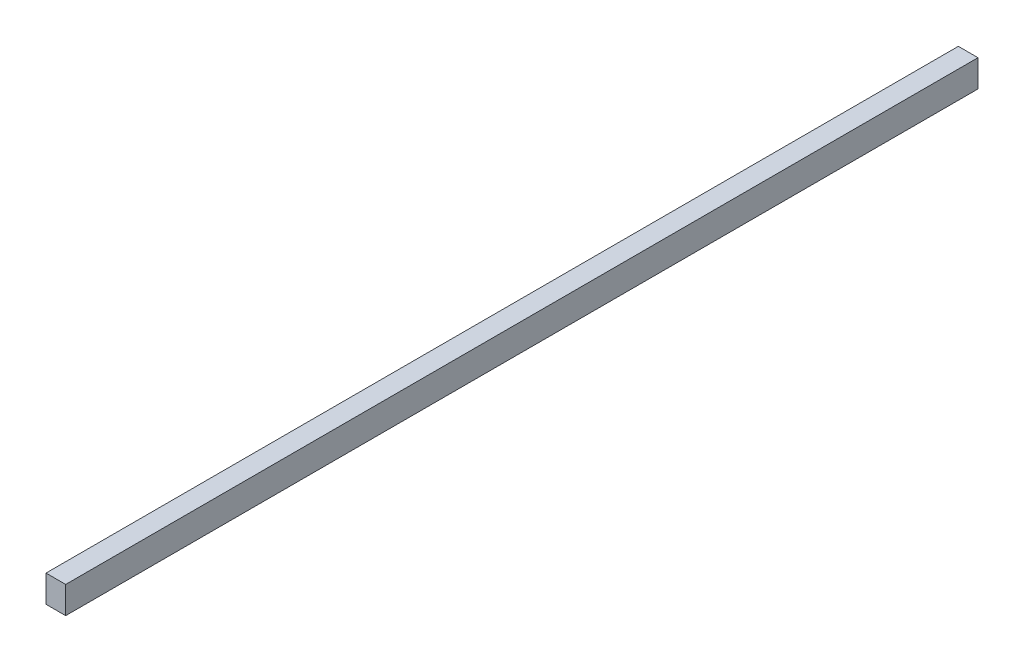
ISO-10303-21;
HEADER;
FILE_DESCRIPTION(('STEP AP214'),'2;1');
FILE_NAME('part.step','',(''),(''),'','','');
FILE_SCHEMA(('AUTOMOTIVE_DESIGN { 1 0 10303 214 1 1 1 1 }'));
ENDSEC;
DATA;
#1=APPLICATION_CONTEXT('core data for automotive mechanical design processes');
#2=APPLICATION_PROTOCOL_DEFINITION('international standard','automotive_design',2000,#1);
#3=PRODUCT_CONTEXT('',#1,'mechanical');
#4=PRODUCT('Part','Part','',(#3));
#5=PRODUCT_RELATED_PRODUCT_CATEGORY('part','',(#4));
#6=PRODUCT_DEFINITION_FORMATION('','',#4);
#7=PRODUCT_DEFINITION_CONTEXT('part definition',#1,'design');
#8=PRODUCT_DEFINITION('design','',#6,#7);
#9=PRODUCT_DEFINITION_SHAPE('','',#8);
#10=(LENGTH_UNIT() NAMED_UNIT(*) SI_UNIT(.MILLI.,.METRE.));
#11=(NAMED_UNIT(*) PLANE_ANGLE_UNIT() SI_UNIT($,.RADIAN.));
#12=(NAMED_UNIT(*) SI_UNIT($,.STERADIAN.) SOLID_ANGLE_UNIT());
#13=UNCERTAINTY_MEASURE_WITH_UNIT(LENGTH_MEASURE(1.E-05),#10,'distance_accuracy_value','');
#14=(GEOMETRIC_REPRESENTATION_CONTEXT(3) GLOBAL_UNCERTAINTY_ASSIGNED_CONTEXT((#13)) GLOBAL_UNIT_ASSIGNED_CONTEXT((#10,
#11,#12)) REPRESENTATION_CONTEXT('',''));
#15=CARTESIAN_POINT('',(0.,0.,0.));
#16=DIRECTION('',(0.,0.,1.));
#17=DIRECTION('',(1.,0.,0.));
#18=AXIS2_PLACEMENT_3D('',#15,#16,#17);
#19=CARTESIAN_POINT('',(0.,0.,-368.046));
#20=DIRECTION('',(-1.,0.,0.));
#21=DIRECTION('',(0.,0.,1.));
#22=AXIS2_PLACEMENT_3D('',#19,#20,#21);
#23=PLANE('',#22);
#24=DIRECTION('',(0.,-1.,0.));
#25=VECTOR('',#24,1.);
#26=CARTESIAN_POINT('',(0.,0.,0.));
#27=LINE('',#26,#25);
#28=CARTESIAN_POINT('',(0.,10.922,0.));
#29=VERTEX_POINT('',#28);
#30=CARTESIAN_POINT('',(0.,0.,0.));
#31=VERTEX_POINT('',#30);
#32=EDGE_CURVE('E109',#29,#31,#27,.T.);
#33=ORIENTED_EDGE('',*,*,#32,.F.);
#34=DIRECTION('',(0.,0.,1.));
#35=VECTOR('',#34,1.);
#36=CARTESIAN_POINT('',(0.,10.922,-368.046));
#37=LINE('',#36,#35);
#38=CARTESIAN_POINT('',(0.,10.922,-368.046));
#39=VERTEX_POINT('',#38);
#40=EDGE_CURVE('E11',#39,#29,#37,.T.);
#41=ORIENTED_EDGE('',*,*,#40,.F.);
#42=DIRECTION('',(0.,-1.,0.));
#43=VECTOR('',#42,1.);
#44=CARTESIAN_POINT('',(0.,0.,-368.046));
#45=LINE('',#44,#43);
#46=CARTESIAN_POINT('',(0.,0.,-368.046));
#47=VERTEX_POINT('',#46);
#48=EDGE_CURVE('E101',#39,#47,#45,.T.);
#49=ORIENTED_EDGE('',*,*,#48,.T.);
#50=DIRECTION('',(0.,0.,1.));
#51=VECTOR('',#50,1.);
#52=CARTESIAN_POINT('',(0.,0.,-368.046));
#53=LINE('',#52,#51);
#54=EDGE_CURVE('E42',#47,#31,#53,.T.);
#55=ORIENTED_EDGE('',*,*,#54,.T.);
#56=EDGE_LOOP('',(#33,#41,#49,#55));
#57=FACE_BOUND('',#56,.T.);
#58=ADVANCED_FACE('F39',(#57),#23,.T.);
#59=CARTESIAN_POINT('',(0.,10.922,-368.046));
#60=DIRECTION('',(0.,1.,0.));
#61=DIRECTION('',(0.,0.,1.));
#62=AXIS2_PLACEMENT_3D('',#59,#60,#61);
#63=PLANE('',#62);
#64=DIRECTION('',(-1.,0.,0.));
#65=VECTOR('',#64,1.);
#66=CARTESIAN_POINT('',(0.,10.922,0.));
#67=LINE('',#66,#65);
#68=CARTESIAN_POINT('',(7.9375,10.922,0.));
#69=VERTEX_POINT('',#68);
#70=EDGE_CURVE('E104',#69,#29,#67,.T.);
#71=ORIENTED_EDGE('',*,*,#70,.F.);
#72=DIRECTION('',(0.,0.,1.));
#73=VECTOR('',#72,1.);
#74=CARTESIAN_POINT('',(7.9375,10.922,-368.046));
#75=LINE('',#74,#73);
#76=CARTESIAN_POINT('',(7.9375,10.922,-368.046));
#77=VERTEX_POINT('',#76);
#78=EDGE_CURVE('E49',#77,#69,#75,.T.);
#79=ORIENTED_EDGE('',*,*,#78,.F.);
#80=DIRECTION('',(-1.,0.,0.));
#81=VECTOR('',#80,1.);
#82=CARTESIAN_POINT('',(0.,10.922,-368.046));
#83=LINE('',#82,#81);
#84=EDGE_CURVE('E96',#77,#39,#83,.T.);
#85=ORIENTED_EDGE('',*,*,#84,.T.);
#86=ORIENTED_EDGE('',*,*,#40,.T.);
#87=EDGE_LOOP('',(#71,#79,#85,#86));
#88=FACE_BOUND('',#87,.T.);
#89=ADVANCED_FACE('F125',(#88),#63,.T.);
#90=CARTESIAN_POINT('',(7.9375,0.,-368.046));
#91=DIRECTION('',(1.,0.,0.));
#92=DIRECTION('',(0.,0.,-1.));
#93=AXIS2_PLACEMENT_3D('',#90,#91,#92);
#94=PLANE('',#93);
#95=DIRECTION('',(0.,1.,0.));
#96=VECTOR('',#95,1.);
#97=CARTESIAN_POINT('',(7.9375,0.,0.));
#98=LINE('',#97,#96);
#99=CARTESIAN_POINT('',(7.9375,0.,0.));
#100=VERTEX_POINT('',#99);
#101=EDGE_CURVE('E90',#100,#69,#98,.T.);
#102=ORIENTED_EDGE('',*,*,#101,.F.);
#103=DIRECTION('',(0.,0.,1.));
#104=VECTOR('',#103,1.);
#105=CARTESIAN_POINT('',(7.9375,0.,-368.046));
#106=LINE('',#105,#104);
#107=CARTESIAN_POINT('',(7.9375,0.,-368.046));
#108=VERTEX_POINT('',#107);
#109=EDGE_CURVE('E85',#108,#100,#106,.T.);
#110=ORIENTED_EDGE('',*,*,#109,.F.);
#111=DIRECTION('',(0.,1.,0.));
#112=VECTOR('',#111,1.);
#113=CARTESIAN_POINT('',(7.9375,0.,-368.046));
#114=LINE('',#113,#112);
#115=EDGE_CURVE('E88',#108,#77,#114,.T.);
#116=ORIENTED_EDGE('',*,*,#115,.T.);
#117=ORIENTED_EDGE('',*,*,#78,.T.);
#118=EDGE_LOOP('',(#102,#110,#116,#117));
#119=FACE_BOUND('',#118,.T.);
#120=ADVANCED_FACE('F87',(#119),#94,.T.);
#121=CARTESIAN_POINT('',(0.,0.,-368.046));
#122=DIRECTION('',(0.,-1.,0.));
#123=DIRECTION('',(0.,0.,-1.));
#124=AXIS2_PLACEMENT_3D('',#121,#122,#123);
#125=PLANE('',#124);
#126=DIRECTION('',(1.,0.,0.));
#127=VECTOR('',#126,1.);
#128=CARTESIAN_POINT('',(0.,0.,0.));
#129=LINE('',#128,#127);
#130=EDGE_CURVE('E113',#31,#100,#129,.T.);
#131=ORIENTED_EDGE('',*,*,#130,.F.);
#132=ORIENTED_EDGE('',*,*,#54,.F.);
#133=DIRECTION('',(1.,0.,0.));
#134=VECTOR('',#133,1.);
#135=CARTESIAN_POINT('',(0.,0.,-368.046));
#136=LINE('',#135,#134);
#137=EDGE_CURVE('E95',#47,#108,#136,.T.);
#138=ORIENTED_EDGE('',*,*,#137,.T.);
#139=ORIENTED_EDGE('',*,*,#109,.T.);
#140=EDGE_LOOP('',(#131,#132,#138,#139));
#141=FACE_BOUND('',#140,.T.);
#142=ADVANCED_FACE('F99',(#141),#125,.T.);
#143=CARTESIAN_POINT('',(0.,0.,-368.046));
#144=DIRECTION('',(0.,0.,-1.));
#145=DIRECTION('',(-1.,0.,0.));
#146=AXIS2_PLACEMENT_3D('',#143,#144,#145);
#147=PLANE('',#146);
#148=ORIENTED_EDGE('',*,*,#48,.F.);
#149=ORIENTED_EDGE('',*,*,#84,.F.);
#150=ORIENTED_EDGE('',*,*,#115,.F.);
#151=ORIENTED_EDGE('',*,*,#137,.F.);
#152=EDGE_LOOP('',(#148,#149,#150,#151));
#153=FACE_BOUND('',#152,.T.);
#154=ADVANCED_FACE('F94',(#153),#147,.T.);
#155=CARTESIAN_POINT('',(0.,0.,0.));
#156=DIRECTION('',(0.,0.,-1.));
#157=DIRECTION('',(-1.,0.,0.));
#158=AXIS2_PLACEMENT_3D('',#155,#156,#157);
#159=PLANE('',#158);
#160=ORIENTED_EDGE('',*,*,#32,.T.);
#161=ORIENTED_EDGE('',*,*,#130,.T.);
#162=ORIENTED_EDGE('',*,*,#101,.T.);
#163=ORIENTED_EDGE('',*,*,#70,.T.);
#164=EDGE_LOOP('',(#160,#161,#162,#163));
#165=FACE_BOUND('',#164,.T.);
#166=ADVANCED_FACE('F124',(#165),#159,.F.);
#167=CLOSED_SHELL('',(#58,#89,#120,#142,#154,#166));
#168=MANIFOLD_SOLID_BREP('B2',#167);
#169=ADVANCED_BREP_SHAPE_REPRESENTATION('',(#18,#168),#14);
#170=SHAPE_DEFINITION_REPRESENTATION(#9,#169);
ENDSEC;
END-ISO-10303-21;
